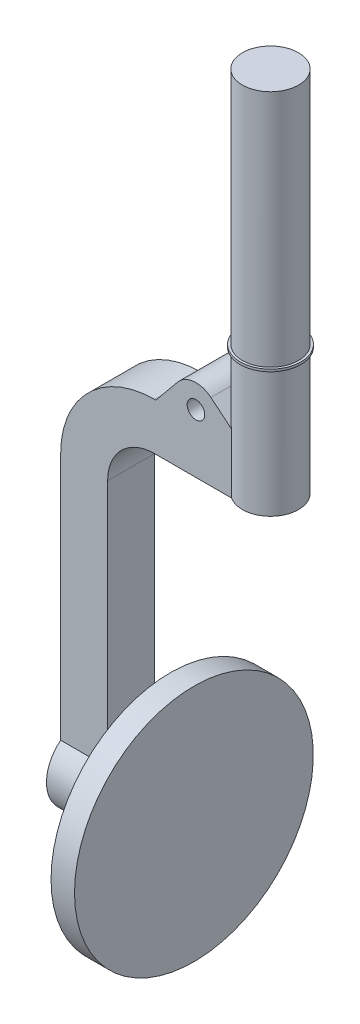
ISO-10303-21;
HEADER;
FILE_DESCRIPTION(('STEP AP214'),'2;1');
FILE_NAME('part.step','',(''),(''),'','','');
FILE_SCHEMA(('AUTOMOTIVE_DESIGN { 1 0 10303 214 1 1 1 1 }'));
ENDSEC;
DATA;
#1=APPLICATION_CONTEXT('core data for automotive mechanical design processes');
#2=APPLICATION_PROTOCOL_DEFINITION('international standard','automotive_design',2000,#1);
#3=PRODUCT_CONTEXT('',#1,'mechanical');
#4=PRODUCT('Part','Part','',(#3));
#5=PRODUCT_RELATED_PRODUCT_CATEGORY('part','',(#4));
#6=PRODUCT_DEFINITION_FORMATION('','',#4);
#7=PRODUCT_DEFINITION_CONTEXT('part definition',#1,'design');
#8=PRODUCT_DEFINITION('design','',#6,#7);
#9=PRODUCT_DEFINITION_SHAPE('','',#8);
#10=(LENGTH_UNIT() NAMED_UNIT(*) SI_UNIT(.MILLI.,.METRE.));
#11=(NAMED_UNIT(*) PLANE_ANGLE_UNIT() SI_UNIT($,.RADIAN.));
#12=(NAMED_UNIT(*) SI_UNIT($,.STERADIAN.) SOLID_ANGLE_UNIT());
#13=UNCERTAINTY_MEASURE_WITH_UNIT(LENGTH_MEASURE(1.E-05),#10,'distance_accuracy_value','');
#14=(GEOMETRIC_REPRESENTATION_CONTEXT(3) GLOBAL_UNCERTAINTY_ASSIGNED_CONTEXT((#13)) GLOBAL_UNIT_ASSIGNED_CONTEXT((#10,
#11,#12)) REPRESENTATION_CONTEXT('',''));
#15=CARTESIAN_POINT('',(0.,0.,0.));
#16=DIRECTION('',(0.,0.,1.));
#17=DIRECTION('',(1.,0.,0.));
#18=AXIS2_PLACEMENT_3D('',#15,#16,#17);
#19=CARTESIAN_POINT('',(27.6225,598.7415,0.));
#20=DIRECTION('',(0.,-1.,0.));
#21=DIRECTION('',(0.,0.,-1.));
#22=AXIS2_PLACEMENT_3D('',#19,#20,#21);
#23=CYLINDRICAL_SURFACE('',#22,30.353);
#24=DIRECTION('',(0.,-1.,0.));
#25=VECTOR('',#24,1.);
#26=CARTESIAN_POINT('',(11.0049006246389,598.7415,25.4));
#27=LINE('',#26,#25);
#28=CARTESIAN_POINT('',(11.0049006246389,200.9775,25.4));
#29=VERTEX_POINT('',#28);
#30=CARTESIAN_POINT('',(11.004900624639,265.508777967499,25.4));
#31=VERTEX_POINT('',#30);
#32=EDGE_CURVE('E118',#29,#31,#27,.F.);
#33=ORIENTED_EDGE('',*,*,#32,.F.);
#34=CARTESIAN_POINT('',(27.6225,200.9775,0.));
#35=DIRECTION('',(0.,-1.,0.));
#36=DIRECTION('',(0.,0.,-1.));
#37=AXIS2_PLACEMENT_3D('',#34,#35,#36);
#38=CIRCLE('',#37,30.353);
#39=CARTESIAN_POINT('',(11.0049006246389,200.9775,-25.4));
#40=VERTEX_POINT('',#39);
#41=EDGE_CURVE('E121',#40,#29,#38,.T.);
#42=ORIENTED_EDGE('',*,*,#41,.F.);
#43=DIRECTION('',(0.,-1.,0.));
#44=VECTOR('',#43,1.);
#45=CARTESIAN_POINT('',(11.0049006246389,598.7415,-25.4));
#46=LINE('',#45,#44);
#47=CARTESIAN_POINT('',(11.004900624639,265.508777967499,-25.4));
#48=VERTEX_POINT('',#47);
#49=EDGE_CURVE('E52',#40,#48,#46,.F.);
#50=ORIENTED_EDGE('',*,*,#49,.T.);
#51=CARTESIAN_POINT('',(27.6225,251.7775,0.));
#52=DIRECTION('',(-0.636983347498845,-0.770877561619979,0.));
#53=DIRECTION('',(0.77087756161998,-0.636983347498845,0.));
#54=AXIS2_PLACEMENT_3D('',#51,#52,#53);
#55=ELLIPSE('',#54,39.3746056587948,30.353);
#56=EDGE_CURVE('E45',#31,#48,#55,.T.);
#57=ORIENTED_EDGE('',*,*,#56,.F.);
#58=EDGE_LOOP('',(#33,#42,#50,#57));
#59=FACE_BOUND('',#58,.T.);
#60=CARTESIAN_POINT('',(27.6225,338.1375,0.));
#61=DIRECTION('',(0.,1.,0.));
#62=DIRECTION('',(0.,0.,1.));
#63=AXIS2_PLACEMENT_3D('',#60,#61,#62);
#64=CIRCLE('',#63,30.353);
#65=CARTESIAN_POINT('',(27.6225,338.1375,30.353));
#66=VERTEX_POINT('',#65);
#67=EDGE_CURVE('E40',#66,#66,#64,.F.);
#68=ORIENTED_EDGE('',*,*,#67,.T.);
#69=EDGE_LOOP('',(#68));
#70=FACE_BOUND('',#69,.T.);
#71=ADVANCED_FACE('F36',(#59,#70),#23,.T.);
#72=CARTESIAN_POINT('',(-72.39,150.1775,25.4));
#73=DIRECTION('',(0.,0.,-1.));
#74=DIRECTION('',(-1.,0.,0.));
#75=AXIS2_PLACEMENT_3D('',#72,#73,#74);
#76=PLANE('',#75);
#77=CARTESIAN_POINT('',(-27.6225,264.4775,25.4));
#78=DIRECTION('',(0.,0.,1.));
#79=DIRECTION('',(1.,0.,0.));
#80=AXIS2_PLACEMENT_3D('',#77,#78,#79);
#81=CIRCLE('',#80,9.525);
#82=CARTESIAN_POINT('',(-18.0975,264.4775,25.4));
#83=VERTEX_POINT('',#82);
#84=EDGE_CURVE('E161',#83,#83,#81,.T.);
#85=ORIENTED_EDGE('',*,*,#84,.F.);
#86=EDGE_LOOP('',(#85));
#87=FACE_BOUND('',#86,.T.);
#88=DIRECTION('',(1.,0.,0.));
#89=VECTOR('',#88,1.);
#90=CARTESIAN_POINT('',(-72.39,200.9775,25.4));
#91=LINE('',#90,#89);
#92=CARTESIAN_POINT('',(-72.39,200.9775,25.4));
#93=VERTEX_POINT('',#92);
#94=EDGE_CURVE('E130',#93,#29,#91,.T.);
#95=ORIENTED_EDGE('',*,*,#94,.T.);
#96=ORIENTED_EDGE('',*,*,#32,.T.);
#97=DIRECTION('',(-0.77087756161998,0.636983347498845,0.));
#98=VECTOR('',#97,1.);
#99=CARTESIAN_POINT('',(-11.4431229735293,284.057790065147,25.4));
#100=LINE('',#99,#98);
#101=CARTESIAN_POINT('',(-11.4431229735293,284.057790065147,25.4));
#102=VERTEX_POINT('',#101);
#103=EDGE_CURVE('E139',#31,#102,#100,.T.);
#104=ORIENTED_EDGE('',*,*,#103,.T.);
#105=CARTESIAN_POINT('',(-27.6225,264.4775,25.4));
#106=DIRECTION('',(0.,0.,1.));
#107=DIRECTION('',(1.,0.,0.));
#108=AXIS2_PLACEMENT_3D('',#105,#106,#107);
#109=CIRCLE('',#108,25.4);
#110=CARTESIAN_POINT('',(-47.2027900651475,280.656877026471,25.4));
#111=VERTEX_POINT('',#110);
#112=EDGE_CURVE('E141',#102,#111,#109,.T.);
#113=ORIENTED_EDGE('',*,*,#112,.T.);
#114=DIRECTION('',(-0.636983347498846,-0.770877561619979,0.));
#115=VECTOR('',#114,1.);
#116=CARTESIAN_POINT('',(-47.2027900651475,280.656877026471,25.4));
#117=LINE('',#116,#115);
#118=CARTESIAN_POINT('',(-71.0660897224166,251.7775,25.4));
#119=VERTEX_POINT('',#118);
#120=EDGE_CURVE('E148',#111,#119,#117,.T.);
#121=ORIENTED_EDGE('',*,*,#120,.T.);
#122=DIRECTION('',(-1.,0.,0.));
#123=VECTOR('',#122,1.);
#124=CARTESIAN_POINT('',(-72.39,251.7775,25.4));
#125=LINE('',#124,#123);
#126=CARTESIAN_POINT('',(-72.39,251.7775,25.4));
#127=VERTEX_POINT('',#126);
#128=EDGE_CURVE('E150',#119,#127,#125,.T.);
#129=ORIENTED_EDGE('',*,*,#128,.T.);
#130=CARTESIAN_POINT('',(-72.39,150.1775,25.4));
#131=DIRECTION('',(0.,0.,1.));
#132=DIRECTION('',(-1.,0.,0.));
#133=AXIS2_PLACEMENT_3D('',#130,#131,#132);
#134=CIRCLE('',#133,101.6);
#135=CARTESIAN_POINT('',(-173.99,150.1775,25.4));
#136=VERTEX_POINT('',#135);
#137=EDGE_CURVE('E152',#127,#136,#134,.T.);
#138=ORIENTED_EDGE('',*,*,#137,.T.);
#139=DIRECTION('',(0.,-1.,0.));
#140=VECTOR('',#139,1.);
#141=CARTESIAN_POINT('',(-173.99,-150.1775,25.4));
#142=LINE('',#141,#140);
#143=CARTESIAN_POINT('',(-173.99,-118.351292239875,25.4));
#144=VERTEX_POINT('',#143);
#145=EDGE_CURVE('E60',#136,#144,#142,.T.);
#146=ORIENTED_EDGE('',*,*,#145,.T.);
#147=DIRECTION('',(-1.,0.,0.));
#148=VECTOR('',#147,1.);
#149=CARTESIAN_POINT('',(-173.99,-118.351292239875,25.4));
#150=LINE('',#149,#148);
#151=CARTESIAN_POINT('',(-123.19,-118.351292239875,25.4));
#152=VERTEX_POINT('',#151);
#153=EDGE_CURVE('E234',#152,#144,#150,.T.);
#154=ORIENTED_EDGE('',*,*,#153,.F.);
#155=DIRECTION('',(0.,1.,0.));
#156=VECTOR('',#155,1.);
#157=CARTESIAN_POINT('',(-123.19,-150.1775,25.4));
#158=LINE('',#157,#156);
#159=CARTESIAN_POINT('',(-123.19,150.1775,25.4));
#160=VERTEX_POINT('',#159);
#161=EDGE_CURVE('E155',#152,#160,#158,.T.);
#162=ORIENTED_EDGE('',*,*,#161,.T.);
#163=CARTESIAN_POINT('',(-72.39,150.1775,25.4));
#164=DIRECTION('',(0.,0.,-1.));
#165=DIRECTION('',(-1.,0.,0.));
#166=AXIS2_PLACEMENT_3D('',#163,#164,#165);
#167=CIRCLE('',#166,50.8);
#168=EDGE_CURVE('E137',#160,#93,#167,.T.);
#169=ORIENTED_EDGE('',*,*,#168,.T.);
#170=EDGE_LOOP('',(#95,#96,#104,#113,#121,#129,#138,#146,#154,#162,#169));
#171=FACE_BOUND('',#170,.T.);
#172=ADVANCED_FACE('F135',(#87,#171),#76,.F.);
#173=CARTESIAN_POINT('',(-72.39,150.1775,-25.4));
#174=DIRECTION('',(0.,0.,-1.));
#175=DIRECTION('',(-1.,0.,0.));
#176=AXIS2_PLACEMENT_3D('',#173,#174,#175);
#177=PLANE('',#176);
#178=ORIENTED_EDGE('',*,*,#49,.F.);
#179=DIRECTION('',(1.,0.,0.));
#180=VECTOR('',#179,1.);
#181=CARTESIAN_POINT('',(-72.39,200.9775,-25.4));
#182=LINE('',#181,#180);
#183=CARTESIAN_POINT('',(-72.39,200.9775,-25.4));
#184=VERTEX_POINT('',#183);
#185=EDGE_CURVE('E132',#184,#40,#182,.T.);
#186=ORIENTED_EDGE('',*,*,#185,.F.);
#187=CARTESIAN_POINT('',(-72.39,150.1775,-25.4));
#188=DIRECTION('',(0.,0.,-1.));
#189=DIRECTION('',(-1.,0.,0.));
#190=AXIS2_PLACEMENT_3D('',#187,#188,#189);
#191=CIRCLE('',#190,50.8);
#192=CARTESIAN_POINT('',(-123.19,150.1775,-25.4));
#193=VERTEX_POINT('',#192);
#194=EDGE_CURVE('E158',#193,#184,#191,.T.);
#195=ORIENTED_EDGE('',*,*,#194,.F.);
#196=DIRECTION('',(0.,1.,0.));
#197=VECTOR('',#196,1.);
#198=CARTESIAN_POINT('',(-123.19,-150.1775,-25.4));
#199=LINE('',#198,#197);
#200=CARTESIAN_POINT('',(-123.19,-118.351292239875,-25.4));
#201=VERTEX_POINT('',#200);
#202=EDGE_CURVE('E143',#201,#193,#199,.T.);
#203=ORIENTED_EDGE('',*,*,#202,.F.);
#204=DIRECTION('',(-1.,0.,0.));
#205=VECTOR('',#204,1.);
#206=CARTESIAN_POINT('',(-173.99,-118.351292239875,-25.4));
#207=LINE('',#206,#205);
#208=CARTESIAN_POINT('',(-173.99,-118.351292239875,-25.4));
#209=VERTEX_POINT('',#208);
#210=EDGE_CURVE('E231',#201,#209,#207,.T.);
#211=ORIENTED_EDGE('',*,*,#210,.T.);
#212=DIRECTION('',(0.,-1.,0.));
#213=VECTOR('',#212,1.);
#214=CARTESIAN_POINT('',(-173.99,-150.1775,-25.4));
#215=LINE('',#214,#213);
#216=CARTESIAN_POINT('',(-173.99,150.1775,-25.4));
#217=VERTEX_POINT('',#216);
#218=EDGE_CURVE('E173',#217,#209,#215,.T.);
#219=ORIENTED_EDGE('',*,*,#218,.F.);
#220=CARTESIAN_POINT('',(-72.39,150.1775,-25.4));
#221=DIRECTION('',(0.,0.,1.));
#222=DIRECTION('',(-1.,0.,0.));
#223=AXIS2_PLACEMENT_3D('',#220,#221,#222);
#224=CIRCLE('',#223,101.6);
#225=CARTESIAN_POINT('',(-72.39,251.7775,-25.4));
#226=VERTEX_POINT('',#225);
#227=EDGE_CURVE('E171',#226,#217,#224,.T.);
#228=ORIENTED_EDGE('',*,*,#227,.F.);
#229=DIRECTION('',(-1.,0.,0.));
#230=VECTOR('',#229,1.);
#231=CARTESIAN_POINT('',(-72.39,251.7775,-25.4));
#232=LINE('',#231,#230);
#233=CARTESIAN_POINT('',(-71.0660897224166,251.7775,-25.4));
#234=VERTEX_POINT('',#233);
#235=EDGE_CURVE('E169',#234,#226,#232,.T.);
#236=ORIENTED_EDGE('',*,*,#235,.F.);
#237=DIRECTION('',(-0.636983347498846,-0.770877561619979,0.));
#238=VECTOR('',#237,1.);
#239=CARTESIAN_POINT('',(-47.2027900651475,280.656877026471,-25.4));
#240=LINE('',#239,#238);
#241=CARTESIAN_POINT('',(-47.2027900651475,280.656877026471,-25.4));
#242=VERTEX_POINT('',#241);
#243=EDGE_CURVE('E167',#242,#234,#240,.T.);
#244=ORIENTED_EDGE('',*,*,#243,.F.);
#245=CARTESIAN_POINT('',(-27.6225,264.4775,-25.4));
#246=DIRECTION('',(0.,0.,1.));
#247=DIRECTION('',(1.,0.,0.));
#248=AXIS2_PLACEMENT_3D('',#245,#246,#247);
#249=CIRCLE('',#248,25.4);
#250=CARTESIAN_POINT('',(-11.4431229735293,284.057790065147,-25.4));
#251=VERTEX_POINT('',#250);
#252=EDGE_CURVE('E165',#251,#242,#249,.T.);
#253=ORIENTED_EDGE('',*,*,#252,.F.);
#254=DIRECTION('',(-0.77087756161998,0.636983347498845,0.));
#255=VECTOR('',#254,1.);
#256=CARTESIAN_POINT('',(-11.4431229735293,284.057790065147,-25.4));
#257=LINE('',#256,#255);
#258=EDGE_CURVE('E163',#48,#251,#257,.T.);
#259=ORIENTED_EDGE('',*,*,#258,.F.);
#260=EDGE_LOOP('',(#178,#186,#195,#203,#211,#219,#228,#236,#244,#253,#259));
#261=FACE_BOUND('',#260,.T.);
#262=CARTESIAN_POINT('',(-27.6225,264.4775,-25.4));
#263=DIRECTION('',(0.,0.,1.));
#264=DIRECTION('',(1.,0.,0.));
#265=AXIS2_PLACEMENT_3D('',#262,#263,#264);
#266=CIRCLE('',#265,9.525);
#267=CARTESIAN_POINT('',(-18.0975,264.4775,-25.4));
#268=VERTEX_POINT('',#267);
#269=EDGE_CURVE('E242',#268,#268,#266,.T.);
#270=ORIENTED_EDGE('',*,*,#269,.T.);
#271=EDGE_LOOP('',(#270));
#272=FACE_BOUND('',#271,.T.);
#273=ADVANCED_FACE('F202',(#261,#272),#177,.T.);
#274=CARTESIAN_POINT('',(-72.39,150.1775,25.4));
#275=DIRECTION('',(0.,0.,-1.));
#276=DIRECTION('',(-1.,0.,0.));
#277=AXIS2_PLACEMENT_3D('',#274,#275,#276);
#278=CYLINDRICAL_SURFACE('',#277,50.8);
#279=ORIENTED_EDGE('',*,*,#194,.T.);
#280=DIRECTION('',(0.,0.,-1.));
#281=VECTOR('',#280,1.);
#282=CARTESIAN_POINT('',(-72.39,200.9775,25.4));
#283=LINE('',#282,#281);
#284=EDGE_CURVE('E194',#93,#184,#283,.T.);
#285=ORIENTED_EDGE('',*,*,#284,.F.);
#286=ORIENTED_EDGE('',*,*,#168,.F.);
#287=DIRECTION('',(0.,0.,-1.));
#288=VECTOR('',#287,1.);
#289=CARTESIAN_POINT('',(-123.19,150.1775,25.4));
#290=LINE('',#289,#288);
#291=EDGE_CURVE('E157',#160,#193,#290,.T.);
#292=ORIENTED_EDGE('',*,*,#291,.T.);
#293=EDGE_LOOP('',(#279,#285,#286,#292));
#294=FACE_BOUND('',#293,.T.);
#295=ADVANCED_FACE('F38',(#294),#278,.F.);
#296=CARTESIAN_POINT('',(-72.39,200.9775,25.4));
#297=DIRECTION('',(0.,1.,0.));
#298=DIRECTION('',(-1.,0.,0.));
#299=AXIS2_PLACEMENT_3D('',#296,#297,#298);
#300=PLANE('',#299);
#301=ORIENTED_EDGE('',*,*,#41,.T.);
#302=ORIENTED_EDGE('',*,*,#94,.F.);
#303=ORIENTED_EDGE('',*,*,#284,.T.);
#304=ORIENTED_EDGE('',*,*,#185,.T.);
#305=EDGE_LOOP('',(#301,#302,#303,#304));
#306=FACE_BOUND('',#305,.T.);
#307=ADVANCED_FACE('F128',(#306),#300,.F.);
#308=CARTESIAN_POINT('',(-11.4431229735293,284.057790065147,25.4));
#309=DIRECTION('',(-0.636983347498845,-0.770877561619979,0.));
#310=DIRECTION('',(0.77087756161998,-0.636983347498845,0.));
#311=AXIS2_PLACEMENT_3D('',#308,#309,#310);
#312=PLANE('',#311);
#313=ORIENTED_EDGE('',*,*,#103,.F.);
#314=ORIENTED_EDGE('',*,*,#56,.T.);
#315=ORIENTED_EDGE('',*,*,#258,.T.);
#316=DIRECTION('',(0.,0.,-1.));
#317=VECTOR('',#316,1.);
#318=CARTESIAN_POINT('',(-11.4431229735293,284.057790065147,25.4));
#319=LINE('',#318,#317);
#320=EDGE_CURVE('E191',#102,#251,#319,.T.);
#321=ORIENTED_EDGE('',*,*,#320,.F.);
#322=EDGE_LOOP('',(#313,#314,#315,#321));
#323=FACE_BOUND('',#322,.T.);
#324=ADVANCED_FACE('F198',(#323),#312,.F.);
#325=CARTESIAN_POINT('',(-27.6225,264.4775,25.4));
#326=DIRECTION('',(0.,0.,-1.));
#327=DIRECTION('',(-1.,0.,0.));
#328=AXIS2_PLACEMENT_3D('',#325,#326,#327);
#329=CYLINDRICAL_SURFACE('',#328,25.4);
#330=ORIENTED_EDGE('',*,*,#252,.T.);
#331=DIRECTION('',(0.,0.,-1.));
#332=VECTOR('',#331,1.);
#333=CARTESIAN_POINT('',(-47.2027900651475,280.656877026471,25.4));
#334=LINE('',#333,#332);
#335=EDGE_CURVE('E188',#111,#242,#334,.T.);
#336=ORIENTED_EDGE('',*,*,#335,.F.);
#337=ORIENTED_EDGE('',*,*,#112,.F.);
#338=ORIENTED_EDGE('',*,*,#320,.T.);
#339=EDGE_LOOP('',(#330,#336,#337,#338));
#340=FACE_BOUND('',#339,.T.);
#341=ADVANCED_FACE('F208',(#340),#329,.T.);
#342=CARTESIAN_POINT('',(-47.2027900651475,280.656877026471,25.4));
#343=DIRECTION('',(0.770877561619979,-0.636983347498846,0.));
#344=DIRECTION('',(0.636983347498846,0.770877561619979,0.));
#345=AXIS2_PLACEMENT_3D('',#342,#343,#344);
#346=PLANE('',#345);
#347=ORIENTED_EDGE('',*,*,#243,.T.);
#348=DIRECTION('',(0.,0.,-1.));
#349=VECTOR('',#348,1.);
#350=CARTESIAN_POINT('',(-71.0660897224166,251.7775,25.4));
#351=LINE('',#350,#349);
#352=EDGE_CURVE('E185',#119,#234,#351,.T.);
#353=ORIENTED_EDGE('',*,*,#352,.F.);
#354=ORIENTED_EDGE('',*,*,#120,.F.);
#355=ORIENTED_EDGE('',*,*,#335,.T.);
#356=EDGE_LOOP('',(#347,#353,#354,#355));
#357=FACE_BOUND('',#356,.T.);
#358=ADVANCED_FACE('F212',(#357),#346,.F.);
#359=CARTESIAN_POINT('',(-72.39,251.7775,25.4));
#360=DIRECTION('',(0.,-1.,0.));
#361=DIRECTION('',(0.,0.,-1.));
#362=AXIS2_PLACEMENT_3D('',#359,#360,#361);
#363=PLANE('',#362);
#364=ORIENTED_EDGE('',*,*,#235,.T.);
#365=DIRECTION('',(0.,0.,-1.));
#366=VECTOR('',#365,1.);
#367=CARTESIAN_POINT('',(-72.39,251.7775,25.4));
#368=LINE('',#367,#366);
#369=EDGE_CURVE('E182',#127,#226,#368,.T.);
#370=ORIENTED_EDGE('',*,*,#369,.F.);
#371=ORIENTED_EDGE('',*,*,#128,.F.);
#372=ORIENTED_EDGE('',*,*,#352,.T.);
#373=EDGE_LOOP('',(#364,#370,#371,#372));
#374=FACE_BOUND('',#373,.T.);
#375=ADVANCED_FACE('F219',(#374),#363,.F.);
#376=CARTESIAN_POINT('',(-72.39,150.1775,25.4));
#377=DIRECTION('',(0.,0.,-1.));
#378=DIRECTION('',(-1.,0.,0.));
#379=AXIS2_PLACEMENT_3D('',#376,#377,#378);
#380=CYLINDRICAL_SURFACE('',#379,101.6);
#381=ORIENTED_EDGE('',*,*,#227,.T.);
#382=DIRECTION('',(0.,0.,-1.));
#383=VECTOR('',#382,1.);
#384=CARTESIAN_POINT('',(-173.99,150.1775,25.4));
#385=LINE('',#384,#383);
#386=EDGE_CURVE('E179',#136,#217,#385,.T.);
#387=ORIENTED_EDGE('',*,*,#386,.F.);
#388=ORIENTED_EDGE('',*,*,#137,.F.);
#389=ORIENTED_EDGE('',*,*,#369,.T.);
#390=EDGE_LOOP('',(#381,#387,#388,#389));
#391=FACE_BOUND('',#390,.T.);
#392=ADVANCED_FACE('F222',(#391),#380,.T.);
#393=CARTESIAN_POINT('',(-173.99,-150.1775,25.4));
#394=DIRECTION('',(1.,0.,0.));
#395=DIRECTION('',(0.,1.,0.));
#396=AXIS2_PLACEMENT_3D('',#393,#394,#395);
#397=PLANE('',#396);
#398=ORIENTED_EDGE('',*,*,#218,.T.);
#399=CARTESIAN_POINT('',(-173.99,-150.1775,0.));
#400=DIRECTION('',(-1.,0.,0.));
#401=DIRECTION('',(0.,0.,1.));
#402=AXIS2_PLACEMENT_3D('',#399,#400,#401);
#403=CIRCLE('',#402,40.719375);
#404=EDGE_CURVE('E228',#209,#144,#403,.T.);
#405=ORIENTED_EDGE('',*,*,#404,.T.);
#406=ORIENTED_EDGE('',*,*,#145,.F.);
#407=ORIENTED_EDGE('',*,*,#386,.T.);
#408=EDGE_LOOP('',(#398,#405,#406,#407));
#409=FACE_BOUND('',#408,.T.);
#410=ADVANCED_FACE('F226',(#409),#397,.F.);
#411=CARTESIAN_POINT('',(-123.19,-150.1775,25.4));
#412=DIRECTION('',(-1.,0.,0.));
#413=DIRECTION('',(0.,0.,1.));
#414=AXIS2_PLACEMENT_3D('',#411,#412,#413);
#415=PLANE('',#414);
#416=ORIENTED_EDGE('',*,*,#161,.F.);
#417=CARTESIAN_POINT('',(-123.19,-150.1775,0.));
#418=DIRECTION('',(-1.,0.,0.));
#419=DIRECTION('',(0.,0.,1.));
#420=AXIS2_PLACEMENT_3D('',#417,#418,#419);
#421=CIRCLE('',#420,40.719375);
#422=EDGE_CURVE('E232',#201,#152,#421,.T.);
#423=ORIENTED_EDGE('',*,*,#422,.F.);
#424=ORIENTED_EDGE('',*,*,#202,.T.);
#425=ORIENTED_EDGE('',*,*,#291,.F.);
#426=EDGE_LOOP('',(#416,#423,#424,#425));
#427=FACE_BOUND('',#426,.T.);
#428=CARTESIAN_POINT('',(-123.19,-150.1775,0.));
#429=DIRECTION('',(-1.,0.,0.));
#430=DIRECTION('',(0.,0.,1.));
#431=AXIS2_PLACEMENT_3D('',#428,#429,#430);
#432=CIRCLE('',#431,25.4);
#433=CARTESIAN_POINT('',(-123.19,-150.1775,25.4));
#434=VERTEX_POINT('',#433);
#435=EDGE_CURVE('E237',#434,#434,#432,.T.);
#436=ORIENTED_EDGE('',*,*,#435,.T.);
#437=EDGE_LOOP('',(#436));
#438=FACE_BOUND('',#437,.T.);
#439=ADVANCED_FACE('F250',(#427,#438),#415,.F.);
#440=CARTESIAN_POINT('',(-27.6225,264.4775,25.4));
#441=DIRECTION('',(0.,0.,-1.));
#442=DIRECTION('',(-1.,0.,0.));
#443=AXIS2_PLACEMENT_3D('',#440,#441,#442);
#444=CYLINDRICAL_SURFACE('',#443,9.525);
#445=ORIENTED_EDGE('',*,*,#84,.T.);
#446=EDGE_LOOP('',(#445));
#447=FACE_BOUND('',#446,.T.);
#448=ORIENTED_EDGE('',*,*,#269,.F.);
#449=EDGE_LOOP('',(#448));
#450=FACE_BOUND('',#449,.T.);
#451=ADVANCED_FACE('F247',(#447,#450),#444,.F.);
#452=CARTESIAN_POINT('',(-173.99,-150.1775,0.));
#453=DIRECTION('',(-1.,0.,0.));
#454=DIRECTION('',(0.,0.,1.));
#455=AXIS2_PLACEMENT_3D('',#452,#453,#454);
#456=CYLINDRICAL_SURFACE('',#455,40.719375);
#457=ORIENTED_EDGE('',*,*,#422,.T.);
#458=ORIENTED_EDGE('',*,*,#153,.T.);
#459=ORIENTED_EDGE('',*,*,#404,.F.);
#460=ORIENTED_EDGE('',*,*,#210,.F.);
#461=EDGE_LOOP('',(#457,#458,#459,#460));
#462=FACE_BOUND('',#461,.T.);
#463=ADVANCED_FACE('F249',(#462),#456,.T.);
#464=CARTESIAN_POINT('',(-173.99,-150.1775,0.));
#465=DIRECTION('',(-1.,0.,0.));
#466=DIRECTION('',(0.,0.,1.));
#467=AXIS2_PLACEMENT_3D('',#464,#465,#466);
#468=CYLINDRICAL_SURFACE('',#467,25.4);
#469=ORIENTED_EDGE('',*,*,#435,.F.);
#470=EDGE_LOOP('',(#469));
#471=FACE_BOUND('',#470,.T.);
#472=CARTESIAN_POINT('',(-80.645,-150.1775,0.));
#473=DIRECTION('',(-1.,0.,0.));
#474=DIRECTION('',(0.,0.,1.));
#475=AXIS2_PLACEMENT_3D('',#472,#473,#474);
#476=CIRCLE('',#475,25.4);
#477=CARTESIAN_POINT('',(-80.645,-150.1775,25.4));
#478=VERTEX_POINT('',#477);
#479=EDGE_CURVE('E294',#478,#478,#476,.T.);
#480=ORIENTED_EDGE('',*,*,#479,.T.);
#481=EDGE_LOOP('',(#480));
#482=FACE_BOUND('',#481,.T.);
#483=ADVANCED_FACE('F257',(#471,#482),#468,.T.);
#484=CARTESIAN_POINT('',(-80.645,-150.1775,25.4));
#485=DIRECTION('',(1.,0.,0.));
#486=DIRECTION('',(0.,0.,-1.));
#487=AXIS2_PLACEMENT_3D('',#484,#485,#486);
#488=PLANE('',#487);
#489=ORIENTED_EDGE('',*,*,#479,.F.);
#490=EDGE_LOOP('',(#489));
#491=FACE_BOUND('',#490,.T.);
#492=CARTESIAN_POINT('',(-80.645,-150.1775,0.));
#493=DIRECTION('',(-1.,0.,0.));
#494=DIRECTION('',(0.,0.,1.));
#495=AXIS2_PLACEMENT_3D('',#492,#493,#494);
#496=CIRCLE('',#495,129.159);
#497=CARTESIAN_POINT('',(-80.645,-150.1775,129.159));
#498=VERTEX_POINT('',#497);
#499=EDGE_CURVE('E291',#498,#498,#496,.T.);
#500=ORIENTED_EDGE('',*,*,#499,.T.);
#501=EDGE_LOOP('',(#500));
#502=FACE_BOUND('',#501,.T.);
#503=ADVANCED_FACE('F302',(#491,#502),#488,.F.);
#504=CARTESIAN_POINT('',(-173.99,-150.1775,0.));
#505=DIRECTION('',(-1.,0.,0.));
#506=DIRECTION('',(0.,0.,1.));
#507=AXIS2_PLACEMENT_3D('',#504,#505,#506);
#508=CYLINDRICAL_SURFACE('',#507,129.159);
#509=ORIENTED_EDGE('',*,*,#499,.F.);
#510=EDGE_LOOP('',(#509));
#511=FACE_BOUND('',#510,.T.);
#512=CARTESIAN_POINT('',(-55.245,-150.1775,0.));
#513=DIRECTION('',(-1.,0.,0.));
#514=DIRECTION('',(0.,0.,1.));
#515=AXIS2_PLACEMENT_3D('',#512,#513,#514);
#516=CIRCLE('',#515,129.159);
#517=CARTESIAN_POINT('',(-55.245,-150.1775,129.159));
#518=VERTEX_POINT('',#517);
#519=EDGE_CURVE('E124',#518,#518,#516,.T.);
#520=ORIENTED_EDGE('',*,*,#519,.T.);
#521=EDGE_LOOP('',(#520));
#522=FACE_BOUND('',#521,.T.);
#523=ADVANCED_FACE('F308',(#511,#522),#508,.T.);
#524=CARTESIAN_POINT('',(-55.245,-150.1775,129.159));
#525=DIRECTION('',(-1.,0.,0.));
#526=DIRECTION('',(0.,0.,1.));
#527=AXIS2_PLACEMENT_3D('',#524,#525,#526);
#528=PLANE('',#527);
#529=ORIENTED_EDGE('',*,*,#519,.F.);
#530=EDGE_LOOP('',(#529));
#531=FACE_BOUND('',#530,.T.);
#532=ADVANCED_FACE('F314',(#531),#528,.F.);
#533=CARTESIAN_POINT('',(27.6225,338.1375,0.));
#534=DIRECTION('',(0.,1.,0.));
#535=DIRECTION('',(0.,0.,1.));
#536=AXIS2_PLACEMENT_3D('',#533,#534,#535);
#537=CYLINDRICAL_SURFACE('',#536,32.893);
#538=CARTESIAN_POINT('',(27.6225,338.1375,0.));
#539=DIRECTION('',(0.,1.,0.));
#540=DIRECTION('',(0.,0.,1.));
#541=AXIS2_PLACEMENT_3D('',#538,#539,#540);
#542=CIRCLE('',#541,32.893);
#543=CARTESIAN_POINT('',(27.6225,338.1375,32.893));
#544=VERTEX_POINT('',#543);
#545=EDGE_CURVE('E341',#544,#544,#542,.T.);
#546=ORIENTED_EDGE('',*,*,#545,.T.);
#547=EDGE_LOOP('',(#546));
#548=FACE_BOUND('',#547,.T.);
#549=CARTESIAN_POINT('',(27.6225,340.6775,0.));
#550=DIRECTION('',(0.,1.,0.));
#551=DIRECTION('',(0.,0.,1.));
#552=AXIS2_PLACEMENT_3D('',#549,#550,#551);
#553=CIRCLE('',#552,32.893);
#554=CARTESIAN_POINT('',(27.6225,340.6775,32.893));
#555=VERTEX_POINT('',#554);
#556=EDGE_CURVE('E286',#555,#555,#553,.T.);
#557=ORIENTED_EDGE('',*,*,#556,.F.);
#558=EDGE_LOOP('',(#557));
#559=FACE_BOUND('',#558,.T.);
#560=ADVANCED_FACE('F319',(#548,#559),#537,.T.);
#561=CARTESIAN_POINT('',(27.6225,338.1375,0.));
#562=DIRECTION('',(0.,1.,0.));
#563=DIRECTION('',(0.,0.,1.));
#564=AXIS2_PLACEMENT_3D('',#561,#562,#563);
#565=PLANE('',#564);
#566=ORIENTED_EDGE('',*,*,#67,.F.);
#567=EDGE_LOOP('',(#566));
#568=FACE_BOUND('',#567,.T.);
#569=ORIENTED_EDGE('',*,*,#545,.F.);
#570=EDGE_LOOP('',(#569));
#571=FACE_BOUND('',#570,.T.);
#572=ADVANCED_FACE('F323',(#568,#571),#565,.F.);
#573=CARTESIAN_POINT('',(27.6225,340.6775,0.));
#574=DIRECTION('',(0.,1.,0.));
#575=DIRECTION('',(0.,0.,1.));
#576=AXIS2_PLACEMENT_3D('',#573,#574,#575);
#577=PLANE('',#576);
#578=CARTESIAN_POINT('',(27.6225,340.6775,0.));
#579=DIRECTION('',(0.,1.,0.));
#580=DIRECTION('',(0.,0.,1.));
#581=AXIS2_PLACEMENT_3D('',#578,#579,#580);
#582=CIRCLE('',#581,30.353);
#583=CARTESIAN_POINT('',(27.6225,340.6775,30.353));
#584=VERTEX_POINT('',#583);
#585=EDGE_CURVE('E11',#584,#584,#582,.F.);
#586=ORIENTED_EDGE('',*,*,#585,.T.);
#587=EDGE_LOOP('',(#586));
#588=FACE_BOUND('',#587,.T.);
#589=ORIENTED_EDGE('',*,*,#556,.T.);
#590=EDGE_LOOP('',(#589));
#591=FACE_BOUND('',#590,.T.);
#592=ADVANCED_FACE('F277',(#588,#591),#577,.T.);
#593=CARTESIAN_POINT('',(27.6225,598.7415,0.));
#594=DIRECTION('',(0.,-1.,0.));
#595=DIRECTION('',(0.,0.,-1.));
#596=AXIS2_PLACEMENT_3D('',#593,#594,#595);
#597=PLANE('',#596);
#598=CARTESIAN_POINT('',(27.6225,598.7415,0.));
#599=DIRECTION('',(0.,-1.,0.));
#600=DIRECTION('',(0.,0.,-1.));
#601=AXIS2_PLACEMENT_3D('',#598,#599,#600);
#602=CIRCLE('',#601,30.353);
#603=CARTESIAN_POINT('',(27.6225,598.7415,-30.353));
#604=VERTEX_POINT('',#603);
#605=EDGE_CURVE('E133',#604,#604,#602,.T.);
#606=ORIENTED_EDGE('',*,*,#605,.F.);
#607=EDGE_LOOP('',(#606));
#608=FACE_BOUND('',#607,.T.);
#609=ADVANCED_FACE('F272',(#608),#597,.F.);
#610=ORIENTED_EDGE('',*,*,#585,.F.);
#611=EDGE_LOOP('',(#610));
#612=FACE_BOUND('',#611,.T.);
#613=ORIENTED_EDGE('',*,*,#605,.T.);
#614=EDGE_LOOP('',(#613));
#615=FACE_BOUND('',#614,.T.);
#616=ADVANCED_FACE('F264',(#612,#615),#23,.T.);
#617=CLOSED_SHELL('',(#71,#172,#273,#295,#307,#324,#341,#358,#375,#392,#410,#439,#451,#463,#483,
#503,#523,#532,#560,#572,#592,#609,#616));
#618=MANIFOLD_SOLID_BREP('B2',#617);
#619=ADVANCED_BREP_SHAPE_REPRESENTATION('',(#18,#618),#14);
#620=SHAPE_DEFINITION_REPRESENTATION(#9,#619);
ENDSEC;
END-ISO-10303-21;
